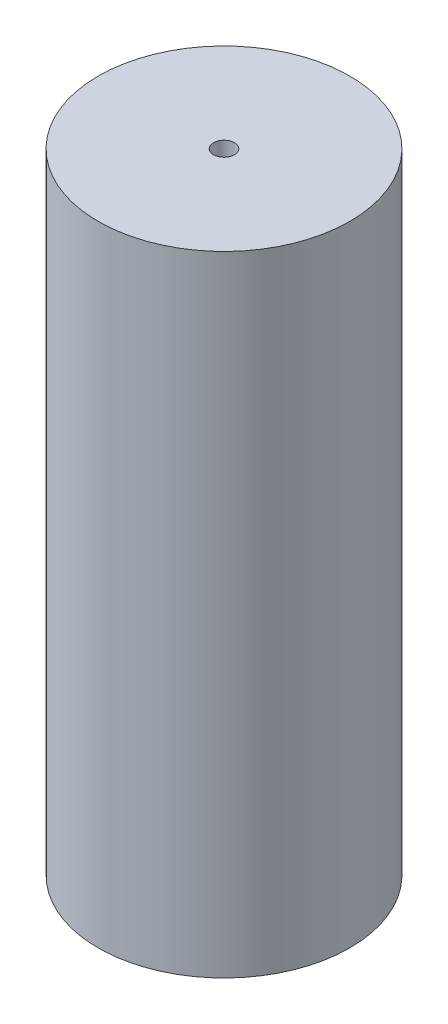
ISO-10303-21;
HEADER;
FILE_DESCRIPTION(('STEP AP214'),'2;1');
FILE_NAME('part.step','',(''),(''),'','','');
FILE_SCHEMA(('AUTOMOTIVE_DESIGN { 1 0 10303 214 1 1 1 1 }'));
ENDSEC;
DATA;
#1=APPLICATION_CONTEXT('core data for automotive mechanical design processes');
#2=APPLICATION_PROTOCOL_DEFINITION('international standard','automotive_design',2000,#1);
#3=PRODUCT_CONTEXT('',#1,'mechanical');
#4=PRODUCT('Part','Part','',(#3));
#5=PRODUCT_RELATED_PRODUCT_CATEGORY('part','',(#4));
#6=PRODUCT_DEFINITION_FORMATION('','',#4);
#7=PRODUCT_DEFINITION_CONTEXT('part definition',#1,'design');
#8=PRODUCT_DEFINITION('design','',#6,#7);
#9=PRODUCT_DEFINITION_SHAPE('','',#8);
#10=(LENGTH_UNIT() NAMED_UNIT(*) SI_UNIT(.MILLI.,.METRE.));
#11=(NAMED_UNIT(*) PLANE_ANGLE_UNIT() SI_UNIT($,.RADIAN.));
#12=(NAMED_UNIT(*) SI_UNIT($,.STERADIAN.) SOLID_ANGLE_UNIT());
#13=UNCERTAINTY_MEASURE_WITH_UNIT(LENGTH_MEASURE(1.E-05),#10,'distance_accuracy_value','');
#14=(GEOMETRIC_REPRESENTATION_CONTEXT(3) GLOBAL_UNCERTAINTY_ASSIGNED_CONTEXT((#13)) GLOBAL_UNIT_ASSIGNED_CONTEXT((#10,
#11,#12)) REPRESENTATION_CONTEXT('',''));
#15=CARTESIAN_POINT('',(0.,0.,0.));
#16=DIRECTION('',(0.,0.,1.));
#17=DIRECTION('',(1.,0.,0.));
#18=AXIS2_PLACEMENT_3D('',#15,#16,#17);
#19=CARTESIAN_POINT('',(0.,15.,0.));
#20=DIRECTION('',(0.,-1.,0.));
#21=DIRECTION('',(1.,0.,0.));
#22=AXIS2_PLACEMENT_3D('',#19,#20,#21);
#23=PLANE('',#22);
#24=CARTESIAN_POINT('',(0.,15.,0.));
#25=DIRECTION('',(0.,1.,0.));
#26=DIRECTION('',(-1.,0.,0.));
#27=AXIS2_PLACEMENT_3D('',#24,#25,#26);
#28=CIRCLE('',#27,0.25);
#29=CARTESIAN_POINT('',(-0.25000000000001,15.,0.));
#30=VERTEX_POINT('',#29);
#31=EDGE_CURVE('E60',#30,#30,#28,.T.);
#32=ORIENTED_EDGE('',*,*,#31,.F.);
#33=EDGE_LOOP('',(#32));
#34=FACE_BOUND('',#33,.T.);
#35=CARTESIAN_POINT('',(0.,15.,0.));
#36=DIRECTION('',(0.,-1.,0.));
#37=DIRECTION('',(1.,0.,0.));
#38=AXIS2_PLACEMENT_3D('',#35,#36,#37);
#39=CIRCLE('',#38,3.);
#40=CARTESIAN_POINT('',(2.99999999999999,15.,0.));
#41=VERTEX_POINT('',#40);
#42=EDGE_CURVE('E10',#41,#41,#39,.T.);
#43=ORIENTED_EDGE('',*,*,#42,.F.);
#44=EDGE_LOOP('',(#43));
#45=FACE_BOUND('',#44,.T.);
#46=ADVANCED_FACE('F37',(#34,#45),#23,.F.);
#47=CARTESIAN_POINT('',(0.,0.,0.));
#48=DIRECTION('',(0.,-1.,0.));
#49=DIRECTION('',(1.,0.,0.));
#50=AXIS2_PLACEMENT_3D('',#47,#48,#49);
#51=CYLINDRICAL_SURFACE('',#50,3.);
#52=CARTESIAN_POINT('',(0.,0.,0.));
#53=DIRECTION('',(0.,-1.,0.));
#54=DIRECTION('',(1.,0.,0.));
#55=AXIS2_PLACEMENT_3D('',#52,#53,#54);
#56=CIRCLE('',#55,3.00000000000001);
#57=CARTESIAN_POINT('',(3.00000000000001,0.,0.));
#58=VERTEX_POINT('',#57);
#59=EDGE_CURVE('E45',#58,#58,#56,.T.);
#60=ORIENTED_EDGE('',*,*,#59,.F.);
#61=EDGE_LOOP('',(#60));
#62=FACE_BOUND('',#61,.T.);
#63=ORIENTED_EDGE('',*,*,#42,.T.);
#64=EDGE_LOOP('',(#63));
#65=FACE_BOUND('',#64,.T.);
#66=ADVANCED_FACE('F81',(#62,#65),#51,.T.);
#67=CARTESIAN_POINT('',(-3.00000000000001,0.,0.));
#68=DIRECTION('',(0.,1.,0.));
#69=DIRECTION('',(-1.,0.,0.));
#70=AXIS2_PLACEMENT_3D('',#67,#68,#69);
#71=PLANE('',#70);
#72=CARTESIAN_POINT('',(0.,0.,0.));
#73=DIRECTION('',(0.,-1.,0.));
#74=DIRECTION('',(1.,0.,0.));
#75=AXIS2_PLACEMENT_3D('',#72,#73,#74);
#76=CIRCLE('',#75,2.);
#77=CARTESIAN_POINT('',(2.,0.,0.));
#78=VERTEX_POINT('',#77);
#79=EDGE_CURVE('E50',#78,#78,#76,.T.);
#80=ORIENTED_EDGE('',*,*,#79,.F.);
#81=EDGE_LOOP('',(#80));
#82=FACE_BOUND('',#81,.T.);
#83=ORIENTED_EDGE('',*,*,#59,.T.);
#84=EDGE_LOOP('',(#83));
#85=FACE_BOUND('',#84,.T.);
#86=ADVANCED_FACE('F86',(#82,#85),#71,.F.);
#87=CARTESIAN_POINT('',(0.,0.,0.));
#88=DIRECTION('',(0.,-1.,0.));
#89=DIRECTION('',(1.,0.,0.));
#90=AXIS2_PLACEMENT_3D('',#87,#88,#89);
#91=CYLINDRICAL_SURFACE('',#90,2.);
#92=CARTESIAN_POINT('',(0.,12.,0.));
#93=DIRECTION('',(0.,-1.,0.));
#94=DIRECTION('',(1.,0.,0.));
#95=AXIS2_PLACEMENT_3D('',#92,#93,#94);
#96=CIRCLE('',#95,2.);
#97=CARTESIAN_POINT('',(1.99999999999999,12.,0.));
#98=VERTEX_POINT('',#97);
#99=EDGE_CURVE('E56',#98,#98,#96,.T.);
#100=ORIENTED_EDGE('',*,*,#99,.F.);
#101=EDGE_LOOP('',(#100));
#102=FACE_BOUND('',#101,.T.);
#103=ORIENTED_EDGE('',*,*,#79,.T.);
#104=EDGE_LOOP('',(#103));
#105=FACE_BOUND('',#104,.T.);
#106=ADVANCED_FACE('F78',(#102,#105),#91,.F.);
#107=CARTESIAN_POINT('',(-2.00000000000001,12.,0.));
#108=DIRECTION('',(0.,1.,0.));
#109=DIRECTION('',(-1.,0.,0.));
#110=AXIS2_PLACEMENT_3D('',#107,#108,#109);
#111=PLANE('',#110);
#112=CARTESIAN_POINT('',(0.,12.,0.));
#113=DIRECTION('',(0.,1.,0.));
#114=DIRECTION('',(-1.,0.,0.));
#115=AXIS2_PLACEMENT_3D('',#112,#113,#114);
#116=CIRCLE('',#115,0.25);
#117=CARTESIAN_POINT('',(-0.250000000000008,12.,0.));
#118=VERTEX_POINT('',#117);
#119=EDGE_CURVE('E40',#118,#118,#116,.T.);
#120=ORIENTED_EDGE('',*,*,#119,.T.);
#121=EDGE_LOOP('',(#120));
#122=FACE_BOUND('',#121,.T.);
#123=ORIENTED_EDGE('',*,*,#99,.T.);
#124=EDGE_LOOP('',(#123));
#125=FACE_BOUND('',#124,.T.);
#126=ADVANCED_FACE('F69',(#122,#125),#111,.F.);
#127=CARTESIAN_POINT('',(0.,0.,0.));
#128=DIRECTION('',(0.,1.,0.));
#129=DIRECTION('',(-1.,0.,0.));
#130=AXIS2_PLACEMENT_3D('',#127,#128,#129);
#131=CYLINDRICAL_SURFACE('',#130,0.25);
#132=ORIENTED_EDGE('',*,*,#31,.T.);
#133=EDGE_LOOP('',(#132));
#134=FACE_BOUND('',#133,.T.);
#135=ORIENTED_EDGE('',*,*,#119,.F.);
#136=EDGE_LOOP('',(#135));
#137=FACE_BOUND('',#136,.T.);
#138=ADVANCED_FACE('F72',(#134,#137),#131,.F.);
#139=CLOSED_SHELL('',(#46,#66,#86,#106,#126,#138));
#140=MANIFOLD_SOLID_BREP('B2',#139);
#141=ADVANCED_BREP_SHAPE_REPRESENTATION('',(#18,#140),#14);
#142=SHAPE_DEFINITION_REPRESENTATION(#9,#141);
ENDSEC;
END-ISO-10303-21;
